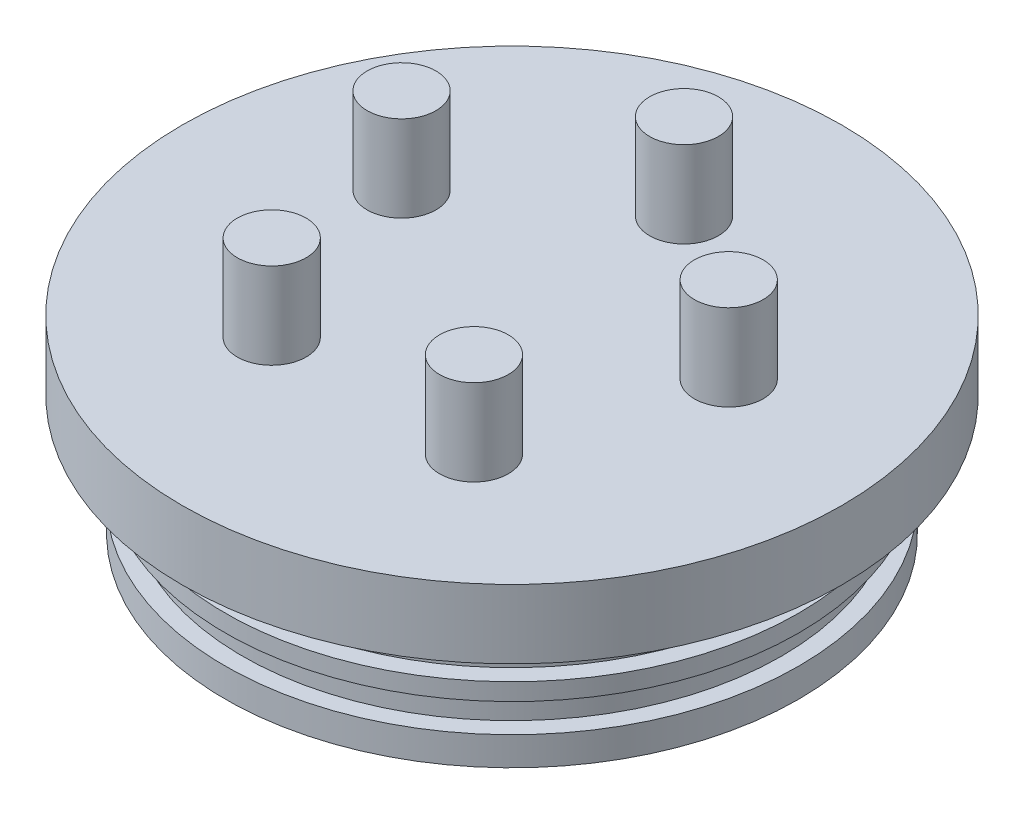
ISO-10303-21;
HEADER;
FILE_DESCRIPTION(('STEP AP214'),'2;1');
FILE_NAME('part.step','',(''),(''),'','','');
FILE_SCHEMA(('AUTOMOTIVE_DESIGN { 1 0 10303 214 1 1 1 1 }'));
ENDSEC;
DATA;
#1=APPLICATION_CONTEXT('core data for automotive mechanical design processes');
#2=APPLICATION_PROTOCOL_DEFINITION('international standard','automotive_design',2000,#1);
#3=PRODUCT_CONTEXT('',#1,'mechanical');
#4=PRODUCT('Part','Part','',(#3));
#5=PRODUCT_RELATED_PRODUCT_CATEGORY('part','',(#4));
#6=PRODUCT_DEFINITION_FORMATION('','',#4);
#7=PRODUCT_DEFINITION_CONTEXT('part definition',#1,'design');
#8=PRODUCT_DEFINITION('design','',#6,#7);
#9=PRODUCT_DEFINITION_SHAPE('','',#8);
#10=(LENGTH_UNIT() NAMED_UNIT(*) SI_UNIT(.MILLI.,.METRE.));
#11=(NAMED_UNIT(*) PLANE_ANGLE_UNIT() SI_UNIT($,.RADIAN.));
#12=(NAMED_UNIT(*) SI_UNIT($,.STERADIAN.) SOLID_ANGLE_UNIT());
#13=UNCERTAINTY_MEASURE_WITH_UNIT(LENGTH_MEASURE(1.E-05),#10,'distance_accuracy_value','');
#14=(GEOMETRIC_REPRESENTATION_CONTEXT(3) GLOBAL_UNCERTAINTY_ASSIGNED_CONTEXT((#13)) GLOBAL_UNIT_ASSIGNED_CONTEXT((#10,
#11,#12)) REPRESENTATION_CONTEXT('',''));
#15=CARTESIAN_POINT('',(0.,0.,0.));
#16=DIRECTION('',(0.,0.,1.));
#17=DIRECTION('',(1.,0.,0.));
#18=AXIS2_PLACEMENT_3D('',#15,#16,#17);
#19=CARTESIAN_POINT('',(0.,0.,0.));
#20=DIRECTION('',(0.,-1.,0.));
#21=DIRECTION('',(1.,0.,0.));
#22=AXIS2_PLACEMENT_3D('',#19,#20,#21);
#23=PLANE('',#22);
#24=CARTESIAN_POINT('',(0.,0.,0.));
#25=DIRECTION('',(0.,-1.,0.));
#26=DIRECTION('',(1.,0.,0.));
#27=AXIS2_PLACEMENT_3D('',#24,#25,#26);
#28=CIRCLE('',#27,45.);
#29=CARTESIAN_POINT('',(45.,0.,0.));
#30=VERTEX_POINT('',#29);
#31=EDGE_CURVE('E10',#30,#30,#28,.T.);
#32=ORIENTED_EDGE('',*,*,#31,.T.);
#33=EDGE_LOOP('',(#32));
#34=FACE_BOUND('',#33,.T.);
#35=ADVANCED_FACE('F32',(#34),#23,.T.);
#36=CARTESIAN_POINT('',(0.,0.,0.));
#37=DIRECTION('',(0.,-1.,0.));
#38=DIRECTION('',(1.,0.,0.));
#39=AXIS2_PLACEMENT_3D('',#36,#37,#38);
#40=CYLINDRICAL_SURFACE('',#39,45.);
#41=CARTESIAN_POINT('',(0.,-27.,0.));
#42=DIRECTION('',(0.,-1.,0.));
#43=DIRECTION('',(1.,0.,0.));
#44=AXIS2_PLACEMENT_3D('',#41,#42,#43);
#45=CIRCLE('',#44,45.);
#46=CARTESIAN_POINT('',(45.,-27.,0.));
#47=VERTEX_POINT('',#46);
#48=EDGE_CURVE('E38',#47,#47,#45,.T.);
#49=ORIENTED_EDGE('',*,*,#48,.T.);
#50=EDGE_LOOP('',(#49));
#51=FACE_BOUND('',#50,.T.);
#52=ORIENTED_EDGE('',*,*,#31,.F.);
#53=EDGE_LOOP('',(#52));
#54=FACE_BOUND('',#53,.T.);
#55=ADVANCED_FACE('F205',(#51,#54),#40,.F.);
#56=CARTESIAN_POINT('',(45.,-27.,0.));
#57=DIRECTION('',(0.,-1.,0.));
#58=DIRECTION('',(1.,0.,0.));
#59=AXIS2_PLACEMENT_3D('',#56,#57,#58);
#60=PLANE('',#59);
#61=CARTESIAN_POINT('',(0.,-27.,0.));
#62=DIRECTION('',(0.,-1.,0.));
#63=DIRECTION('',(1.,0.,0.));
#64=AXIS2_PLACEMENT_3D('',#61,#62,#63);
#65=CIRCLE('',#64,50.);
#66=CARTESIAN_POINT('',(50.,-27.,0.));
#67=VERTEX_POINT('',#66);
#68=EDGE_CURVE('E42',#67,#67,#65,.T.);
#69=ORIENTED_EDGE('',*,*,#68,.T.);
#70=EDGE_LOOP('',(#69));
#71=FACE_BOUND('',#70,.T.);
#72=ORIENTED_EDGE('',*,*,#48,.F.);
#73=EDGE_LOOP('',(#72));
#74=FACE_BOUND('',#73,.T.);
#75=ADVANCED_FACE('F199',(#71,#74),#60,.T.);
#76=CARTESIAN_POINT('',(0.,0.,0.));
#77=DIRECTION('',(0.,-1.,0.));
#78=DIRECTION('',(1.,0.,0.));
#79=AXIS2_PLACEMENT_3D('',#76,#77,#78);
#80=CYLINDRICAL_SURFACE('',#79,50.);
#81=CARTESIAN_POINT('',(0.,-22.,0.));
#82=DIRECTION('',(0.,-1.,0.));
#83=DIRECTION('',(1.,0.,0.));
#84=AXIS2_PLACEMENT_3D('',#81,#82,#83);
#85=CIRCLE('',#84,50.);
#86=CARTESIAN_POINT('',(50.,-22.,0.));
#87=VERTEX_POINT('',#86);
#88=EDGE_CURVE('E46',#87,#87,#85,.T.);
#89=ORIENTED_EDGE('',*,*,#88,.T.);
#90=EDGE_LOOP('',(#89));
#91=FACE_BOUND('',#90,.T.);
#92=ORIENTED_EDGE('',*,*,#68,.F.);
#93=EDGE_LOOP('',(#92));
#94=FACE_BOUND('',#93,.T.);
#95=ADVANCED_FACE('F193',(#91,#94),#80,.T.);
#96=CARTESIAN_POINT('',(50.,-22.,0.));
#97=DIRECTION('',(0.,1.,0.));
#98=DIRECTION('',(-1.,0.,0.));
#99=AXIS2_PLACEMENT_3D('',#96,#97,#98);
#100=PLANE('',#99);
#101=CARTESIAN_POINT('',(0.,-22.,0.));
#102=DIRECTION('',(0.,-1.,0.));
#103=DIRECTION('',(1.,0.,0.));
#104=AXIS2_PLACEMENT_3D('',#101,#102,#103);
#105=CIRCLE('',#104,47.);
#106=CARTESIAN_POINT('',(47.,-22.,0.));
#107=VERTEX_POINT('',#106);
#108=EDGE_CURVE('E51',#107,#107,#105,.T.);
#109=ORIENTED_EDGE('',*,*,#108,.T.);
#110=EDGE_LOOP('',(#109));
#111=FACE_BOUND('',#110,.T.);
#112=ORIENTED_EDGE('',*,*,#88,.F.);
#113=EDGE_LOOP('',(#112));
#114=FACE_BOUND('',#113,.T.);
#115=ADVANCED_FACE('F187',(#111,#114),#100,.T.);
#116=CARTESIAN_POINT('',(0.,0.,0.));
#117=DIRECTION('',(0.,-1.,0.));
#118=DIRECTION('',(1.,0.,0.));
#119=AXIS2_PLACEMENT_3D('',#116,#117,#118);
#120=CYLINDRICAL_SURFACE('',#119,47.);
#121=CARTESIAN_POINT('',(0.,-17.,0.));
#122=DIRECTION('',(0.,-1.,0.));
#123=DIRECTION('',(1.,0.,0.));
#124=AXIS2_PLACEMENT_3D('',#121,#122,#123);
#125=CIRCLE('',#124,47.);
#126=CARTESIAN_POINT('',(47.,-17.,0.));
#127=VERTEX_POINT('',#126);
#128=EDGE_CURVE('E54',#127,#127,#125,.T.);
#129=ORIENTED_EDGE('',*,*,#128,.T.);
#130=EDGE_LOOP('',(#129));
#131=FACE_BOUND('',#130,.T.);
#132=ORIENTED_EDGE('',*,*,#108,.F.);
#133=EDGE_LOOP('',(#132));
#134=FACE_BOUND('',#133,.T.);
#135=ADVANCED_FACE('F181',(#131,#134),#120,.T.);
#136=CARTESIAN_POINT('',(47.,-17.,0.));
#137=DIRECTION('',(0.,-1.,0.));
#138=DIRECTION('',(1.,0.,0.));
#139=AXIS2_PLACEMENT_3D('',#136,#137,#138);
#140=PLANE('',#139);
#141=CARTESIAN_POINT('',(0.,-17.,0.));
#142=DIRECTION('',(0.,-1.,0.));
#143=DIRECTION('',(1.,0.,0.));
#144=AXIS2_PLACEMENT_3D('',#141,#142,#143);
#145=CIRCLE('',#144,50.);
#146=CARTESIAN_POINT('',(50.,-17.,0.));
#147=VERTEX_POINT('',#146);
#148=EDGE_CURVE('E57',#147,#147,#145,.T.);
#149=ORIENTED_EDGE('',*,*,#148,.T.);
#150=EDGE_LOOP('',(#149));
#151=FACE_BOUND('',#150,.T.);
#152=ORIENTED_EDGE('',*,*,#128,.F.);
#153=EDGE_LOOP('',(#152));
#154=FACE_BOUND('',#153,.T.);
#155=ADVANCED_FACE('F175',(#151,#154),#140,.T.);
#156=CARTESIAN_POINT('',(0.,0.,0.));
#157=DIRECTION('',(0.,-1.,0.));
#158=DIRECTION('',(1.,0.,0.));
#159=AXIS2_PLACEMENT_3D('',#156,#157,#158);
#160=CYLINDRICAL_SURFACE('',#159,50.);
#161=CARTESIAN_POINT('',(0.,-14.,0.));
#162=DIRECTION('',(0.,-1.,0.));
#163=DIRECTION('',(1.,0.,0.));
#164=AXIS2_PLACEMENT_3D('',#161,#162,#163);
#165=CIRCLE('',#164,50.);
#166=CARTESIAN_POINT('',(50.,-14.,0.));
#167=VERTEX_POINT('',#166);
#168=EDGE_CURVE('E60',#167,#167,#165,.T.);
#169=ORIENTED_EDGE('',*,*,#168,.T.);
#170=EDGE_LOOP('',(#169));
#171=FACE_BOUND('',#170,.T.);
#172=ORIENTED_EDGE('',*,*,#148,.F.);
#173=EDGE_LOOP('',(#172));
#174=FACE_BOUND('',#173,.T.);
#175=ADVANCED_FACE('F169',(#171,#174),#160,.T.);
#176=CARTESIAN_POINT('',(50.,-14.,0.));
#177=DIRECTION('',(0.,1.,0.));
#178=DIRECTION('',(-1.,0.,0.));
#179=AXIS2_PLACEMENT_3D('',#176,#177,#178);
#180=PLANE('',#179);
#181=CARTESIAN_POINT('',(0.,-14.,0.));
#182=DIRECTION('',(0.,-1.,0.));
#183=DIRECTION('',(1.,0.,0.));
#184=AXIS2_PLACEMENT_3D('',#181,#182,#183);
#185=CIRCLE('',#184,47.);
#186=CARTESIAN_POINT('',(47.,-14.,0.));
#187=VERTEX_POINT('',#186);
#188=EDGE_CURVE('E63',#187,#187,#185,.T.);
#189=ORIENTED_EDGE('',*,*,#188,.T.);
#190=EDGE_LOOP('',(#189));
#191=FACE_BOUND('',#190,.T.);
#192=ORIENTED_EDGE('',*,*,#168,.F.);
#193=EDGE_LOOP('',(#192));
#194=FACE_BOUND('',#193,.T.);
#195=ADVANCED_FACE('F163',(#191,#194),#180,.T.);
#196=CARTESIAN_POINT('',(0.,0.,0.));
#197=DIRECTION('',(0.,-1.,0.));
#198=DIRECTION('',(1.,0.,0.));
#199=AXIS2_PLACEMENT_3D('',#196,#197,#198);
#200=CYLINDRICAL_SURFACE('',#199,47.);
#201=CARTESIAN_POINT('',(0.,-9.,0.));
#202=DIRECTION('',(0.,-1.,0.));
#203=DIRECTION('',(1.,0.,0.));
#204=AXIS2_PLACEMENT_3D('',#201,#202,#203);
#205=CIRCLE('',#204,47.);
#206=CARTESIAN_POINT('',(47.,-8.99999999999999,0.));
#207=VERTEX_POINT('',#206);
#208=EDGE_CURVE('E66',#207,#207,#205,.T.);
#209=ORIENTED_EDGE('',*,*,#208,.T.);
#210=EDGE_LOOP('',(#209));
#211=FACE_BOUND('',#210,.T.);
#212=ORIENTED_EDGE('',*,*,#188,.F.);
#213=EDGE_LOOP('',(#212));
#214=FACE_BOUND('',#213,.T.);
#215=ADVANCED_FACE('F157',(#211,#214),#200,.T.);
#216=CARTESIAN_POINT('',(47.,-8.99999999999999,0.));
#217=DIRECTION('',(0.,-1.,0.));
#218=DIRECTION('',(1.,0.,0.));
#219=AXIS2_PLACEMENT_3D('',#216,#217,#218);
#220=PLANE('',#219);
#221=CARTESIAN_POINT('',(0.,-9.,0.));
#222=DIRECTION('',(0.,-1.,0.));
#223=DIRECTION('',(1.,0.,0.));
#224=AXIS2_PLACEMENT_3D('',#221,#222,#223);
#225=CIRCLE('',#224,50.);
#226=CARTESIAN_POINT('',(50.,-8.99999999999999,0.));
#227=VERTEX_POINT('',#226);
#228=EDGE_CURVE('E69',#227,#227,#225,.T.);
#229=ORIENTED_EDGE('',*,*,#228,.T.);
#230=EDGE_LOOP('',(#229));
#231=FACE_BOUND('',#230,.T.);
#232=ORIENTED_EDGE('',*,*,#208,.F.);
#233=EDGE_LOOP('',(#232));
#234=FACE_BOUND('',#233,.T.);
#235=ADVANCED_FACE('F151',(#231,#234),#220,.T.);
#236=CARTESIAN_POINT('',(0.,0.,0.));
#237=DIRECTION('',(0.,-1.,0.));
#238=DIRECTION('',(1.,0.,0.));
#239=AXIS2_PLACEMENT_3D('',#236,#237,#238);
#240=CYLINDRICAL_SURFACE('',#239,50.);
#241=CARTESIAN_POINT('',(0.,-6.,0.));
#242=DIRECTION('',(0.,-1.,0.));
#243=DIRECTION('',(1.,0.,0.));
#244=AXIS2_PLACEMENT_3D('',#241,#242,#243);
#245=CIRCLE('',#244,50.);
#246=CARTESIAN_POINT('',(50.,-5.99999999999999,0.));
#247=VERTEX_POINT('',#246);
#248=EDGE_CURVE('E72',#247,#247,#245,.T.);
#249=ORIENTED_EDGE('',*,*,#248,.T.);
#250=EDGE_LOOP('',(#249));
#251=FACE_BOUND('',#250,.T.);
#252=ORIENTED_EDGE('',*,*,#228,.F.);
#253=EDGE_LOOP('',(#252));
#254=FACE_BOUND('',#253,.T.);
#255=ADVANCED_FACE('F145',(#251,#254),#240,.T.);
#256=CARTESIAN_POINT('',(50.,-5.99999999999999,0.));
#257=DIRECTION('',(0.,-1.,0.));
#258=DIRECTION('',(1.,0.,0.));
#259=AXIS2_PLACEMENT_3D('',#256,#257,#258);
#260=PLANE('',#259);
#261=CARTESIAN_POINT('',(0.,-6.,0.));
#262=DIRECTION('',(0.,-1.,0.));
#263=DIRECTION('',(1.,0.,0.));
#264=AXIS2_PLACEMENT_3D('',#261,#262,#263);
#265=CIRCLE('',#264,57.5);
#266=CARTESIAN_POINT('',(57.5,-5.99999999999999,0.));
#267=VERTEX_POINT('',#266);
#268=EDGE_CURVE('E75',#267,#267,#265,.T.);
#269=ORIENTED_EDGE('',*,*,#268,.T.);
#270=EDGE_LOOP('',(#269));
#271=FACE_BOUND('',#270,.T.);
#272=ORIENTED_EDGE('',*,*,#248,.F.);
#273=EDGE_LOOP('',(#272));
#274=FACE_BOUND('',#273,.T.);
#275=ADVANCED_FACE('F139',(#271,#274),#260,.T.);
#276=CARTESIAN_POINT('',(0.,0.,0.));
#277=DIRECTION('',(0.,-1.,0.));
#278=DIRECTION('',(1.,0.,0.));
#279=AXIS2_PLACEMENT_3D('',#276,#277,#278);
#280=CYLINDRICAL_SURFACE('',#279,57.5);
#281=CARTESIAN_POINT('',(0.,6.,0.));
#282=DIRECTION('',(0.,-1.,0.));
#283=DIRECTION('',(1.,0.,0.));
#284=AXIS2_PLACEMENT_3D('',#281,#282,#283);
#285=CIRCLE('',#284,57.5);
#286=CARTESIAN_POINT('',(57.5,6.00000000000001,0.));
#287=VERTEX_POINT('',#286);
#288=EDGE_CURVE('E78',#287,#287,#285,.T.);
#289=ORIENTED_EDGE('',*,*,#288,.T.);
#290=EDGE_LOOP('',(#289));
#291=FACE_BOUND('',#290,.T.);
#292=ORIENTED_EDGE('',*,*,#268,.F.);
#293=EDGE_LOOP('',(#292));
#294=FACE_BOUND('',#293,.T.);
#295=ADVANCED_FACE('F125',(#291,#294),#280,.T.);
#296=CARTESIAN_POINT('',(57.5,6.00000000000001,0.));
#297=DIRECTION('',(0.,1.,0.));
#298=DIRECTION('',(-1.,0.,0.));
#299=AXIS2_PLACEMENT_3D('',#296,#297,#298);
#300=PLANE('',#299);
#301=CARTESIAN_POINT('',(-28.5316954888546,6.,-9.27050983124842));
#302=DIRECTION('',(0.,1.,0.));
#303=DIRECTION('',(-1.,0.,0.));
#304=AXIS2_PLACEMENT_3D('',#301,#302,#303);
#305=CIRCLE('',#304,6.);
#306=CARTESIAN_POINT('',(-34.5316954888546,6.,-9.27050983124842));
#307=VERTEX_POINT('',#306);
#308=EDGE_CURVE('E106',#307,#307,#305,.T.);
#309=ORIENTED_EDGE('',*,*,#308,.F.);
#310=EDGE_LOOP('',(#309));
#311=FACE_BOUND('',#310,.T.);
#312=CARTESIAN_POINT('',(-17.6335575687742,6.,24.2705098312484));
#313=DIRECTION('',(0.,1.,0.));
#314=DIRECTION('',(-1.,0.,0.));
#315=AXIS2_PLACEMENT_3D('',#312,#313,#314);
#316=CIRCLE('',#315,6.);
#317=CARTESIAN_POINT('',(-23.6335575687742,6.,24.2705098312484));
#318=VERTEX_POINT('',#317);
#319=EDGE_CURVE('E100',#318,#318,#316,.T.);
#320=ORIENTED_EDGE('',*,*,#319,.F.);
#321=EDGE_LOOP('',(#320));
#322=FACE_BOUND('',#321,.T.);
#323=CARTESIAN_POINT('',(17.6335575687742,6.,24.2705098312484));
#324=DIRECTION('',(0.,1.,0.));
#325=DIRECTION('',(-1.,0.,0.));
#326=AXIS2_PLACEMENT_3D('',#323,#324,#325);
#327=CIRCLE('',#326,6.);
#328=CARTESIAN_POINT('',(11.6335575687742,6.,24.2705098312484));
#329=VERTEX_POINT('',#328);
#330=EDGE_CURVE('E94',#329,#329,#327,.T.);
#331=ORIENTED_EDGE('',*,*,#330,.F.);
#332=EDGE_LOOP('',(#331));
#333=FACE_BOUND('',#332,.T.);
#334=CARTESIAN_POINT('',(28.5316954888546,6.00000000000001,-9.27050983124843));
#335=DIRECTION('',(0.,1.,0.));
#336=DIRECTION('',(-1.,0.,0.));
#337=AXIS2_PLACEMENT_3D('',#334,#335,#336);
#338=CIRCLE('',#337,6.);
#339=CARTESIAN_POINT('',(22.5316954888546,6.00000000000001,-9.27050983124843));
#340=VERTEX_POINT('',#339);
#341=EDGE_CURVE('E88',#340,#340,#338,.T.);
#342=ORIENTED_EDGE('',*,*,#341,.F.);
#343=EDGE_LOOP('',(#342));
#344=FACE_BOUND('',#343,.T.);
#345=CARTESIAN_POINT('',(0.,6.,-30.));
#346=DIRECTION('',(0.,1.,0.));
#347=DIRECTION('',(-1.,0.,0.));
#348=AXIS2_PLACEMENT_3D('',#345,#346,#347);
#349=CIRCLE('',#348,6.);
#350=CARTESIAN_POINT('',(-6.,6.,-30.));
#351=VERTEX_POINT('',#350);
#352=EDGE_CURVE('E82',#351,#351,#349,.T.);
#353=ORIENTED_EDGE('',*,*,#352,.F.);
#354=EDGE_LOOP('',(#353));
#355=FACE_BOUND('',#354,.T.);
#356=ORIENTED_EDGE('',*,*,#288,.F.);
#357=EDGE_LOOP('',(#356));
#358=FACE_BOUND('',#357,.T.);
#359=ADVANCED_FACE('F121',(#311,#322,#333,#344,#355,#358),#300,.T.);
#360=CARTESIAN_POINT('',(0.,21.,-30.));
#361=DIRECTION('',(0.,-1.,0.));
#362=DIRECTION('',(1.,0.,0.));
#363=AXIS2_PLACEMENT_3D('',#360,#361,#362);
#364=CYLINDRICAL_SURFACE('',#363,6.);
#365=CARTESIAN_POINT('',(0.,21.,-30.));
#366=DIRECTION('',(0.,1.,0.));
#367=DIRECTION('',(-1.,0.,0.));
#368=AXIS2_PLACEMENT_3D('',#365,#366,#367);
#369=CIRCLE('',#368,6.);
#370=CARTESIAN_POINT('',(-6.,21.,-30.));
#371=VERTEX_POINT('',#370);
#372=EDGE_CURVE('E81',#371,#371,#369,.T.);
#373=ORIENTED_EDGE('',*,*,#372,.F.);
#374=EDGE_LOOP('',(#373));
#375=FACE_BOUND('',#374,.T.);
#376=ORIENTED_EDGE('',*,*,#352,.T.);
#377=EDGE_LOOP('',(#376));
#378=FACE_BOUND('',#377,.T.);
#379=ADVANCED_FACE('F124',(#375,#378),#364,.T.);
#380=CARTESIAN_POINT('',(0.,21.,-30.));
#381=DIRECTION('',(0.,1.,0.));
#382=DIRECTION('',(-1.,0.,0.));
#383=AXIS2_PLACEMENT_3D('',#380,#381,#382);
#384=PLANE('',#383);
#385=ORIENTED_EDGE('',*,*,#372,.T.);
#386=EDGE_LOOP('',(#385));
#387=FACE_BOUND('',#386,.T.);
#388=ADVANCED_FACE('F303',(#387),#384,.T.);
#389=CARTESIAN_POINT('',(28.5316954888546,21.,-9.27050983124843));
#390=DIRECTION('',(0.,-1.,0.));
#391=DIRECTION('',(1.,0.,0.));
#392=AXIS2_PLACEMENT_3D('',#389,#390,#391);
#393=CYLINDRICAL_SURFACE('',#392,6.);
#394=CARTESIAN_POINT('',(28.5316954888546,21.,-9.27050983124843));
#395=DIRECTION('',(0.,1.,0.));
#396=DIRECTION('',(-1.,0.,0.));
#397=AXIS2_PLACEMENT_3D('',#394,#395,#396);
#398=CIRCLE('',#397,6.);
#399=CARTESIAN_POINT('',(22.5316954888546,21.,-9.27050983124843));
#400=VERTEX_POINT('',#399);
#401=EDGE_CURVE('E85',#400,#400,#398,.T.);
#402=ORIENTED_EDGE('',*,*,#401,.F.);
#403=EDGE_LOOP('',(#402));
#404=FACE_BOUND('',#403,.T.);
#405=ORIENTED_EDGE('',*,*,#341,.T.);
#406=EDGE_LOOP('',(#405));
#407=FACE_BOUND('',#406,.T.);
#408=ADVANCED_FACE('F316',(#404,#407),#393,.T.);
#409=CARTESIAN_POINT('',(28.5316954888546,21.,-9.27050983124843));
#410=DIRECTION('',(0.,1.,0.));
#411=DIRECTION('',(-1.,0.,0.));
#412=AXIS2_PLACEMENT_3D('',#409,#410,#411);
#413=PLANE('',#412);
#414=ORIENTED_EDGE('',*,*,#401,.T.);
#415=EDGE_LOOP('',(#414));
#416=FACE_BOUND('',#415,.T.);
#417=ADVANCED_FACE('F328',(#416),#413,.T.);
#418=CARTESIAN_POINT('',(17.6335575687742,21.,24.2705098312484));
#419=DIRECTION('',(0.,-1.,0.));
#420=DIRECTION('',(1.,0.,0.));
#421=AXIS2_PLACEMENT_3D('',#418,#419,#420);
#422=CYLINDRICAL_SURFACE('',#421,6.);
#423=CARTESIAN_POINT('',(17.6335575687742,21.,24.2705098312484));
#424=DIRECTION('',(0.,1.,0.));
#425=DIRECTION('',(-1.,0.,0.));
#426=AXIS2_PLACEMENT_3D('',#423,#424,#425);
#427=CIRCLE('',#426,6.);
#428=CARTESIAN_POINT('',(11.6335575687742,21.,24.2705098312484));
#429=VERTEX_POINT('',#428);
#430=EDGE_CURVE('E91',#429,#429,#427,.T.);
#431=ORIENTED_EDGE('',*,*,#430,.F.);
#432=EDGE_LOOP('',(#431));
#433=FACE_BOUND('',#432,.T.);
#434=ORIENTED_EDGE('',*,*,#330,.T.);
#435=EDGE_LOOP('',(#434));
#436=FACE_BOUND('',#435,.T.);
#437=ADVANCED_FACE('F338',(#433,#436),#422,.T.);
#438=CARTESIAN_POINT('',(17.6335575687742,21.,24.2705098312484));
#439=DIRECTION('',(0.,1.,0.));
#440=DIRECTION('',(-1.,0.,0.));
#441=AXIS2_PLACEMENT_3D('',#438,#439,#440);
#442=PLANE('',#441);
#443=ORIENTED_EDGE('',*,*,#430,.T.);
#444=EDGE_LOOP('',(#443));
#445=FACE_BOUND('',#444,.T.);
#446=ADVANCED_FACE('F349',(#445),#442,.T.);
#447=CARTESIAN_POINT('',(-17.6335575687742,21.,24.2705098312484));
#448=DIRECTION('',(0.,-1.,0.));
#449=DIRECTION('',(1.,0.,0.));
#450=AXIS2_PLACEMENT_3D('',#447,#448,#449);
#451=CYLINDRICAL_SURFACE('',#450,6.);
#452=CARTESIAN_POINT('',(-17.6335575687742,21.,24.2705098312484));
#453=DIRECTION('',(0.,1.,0.));
#454=DIRECTION('',(-1.,0.,0.));
#455=AXIS2_PLACEMENT_3D('',#452,#453,#454);
#456=CIRCLE('',#455,6.);
#457=CARTESIAN_POINT('',(-23.6335575687742,21.,24.2705098312484));
#458=VERTEX_POINT('',#457);
#459=EDGE_CURVE('E97',#458,#458,#456,.T.);
#460=ORIENTED_EDGE('',*,*,#459,.F.);
#461=EDGE_LOOP('',(#460));
#462=FACE_BOUND('',#461,.T.);
#463=ORIENTED_EDGE('',*,*,#319,.T.);
#464=EDGE_LOOP('',(#463));
#465=FACE_BOUND('',#464,.T.);
#466=ADVANCED_FACE('F361',(#462,#465),#451,.T.);
#467=CARTESIAN_POINT('',(-17.6335575687742,21.,24.2705098312484));
#468=DIRECTION('',(0.,1.,0.));
#469=DIRECTION('',(-1.,0.,0.));
#470=AXIS2_PLACEMENT_3D('',#467,#468,#469);
#471=PLANE('',#470);
#472=ORIENTED_EDGE('',*,*,#459,.T.);
#473=EDGE_LOOP('',(#472));
#474=FACE_BOUND('',#473,.T.);
#475=ADVANCED_FACE('F117',(#474),#471,.T.);
#476=CARTESIAN_POINT('',(-28.5316954888546,21.,-9.27050983124842));
#477=DIRECTION('',(0.,-1.,0.));
#478=DIRECTION('',(1.,0.,0.));
#479=AXIS2_PLACEMENT_3D('',#476,#477,#478);
#480=CYLINDRICAL_SURFACE('',#479,6.);
#481=CARTESIAN_POINT('',(-28.5316954888546,21.,-9.27050983124842));
#482=DIRECTION('',(0.,1.,0.));
#483=DIRECTION('',(-1.,0.,0.));
#484=AXIS2_PLACEMENT_3D('',#481,#482,#483);
#485=CIRCLE('',#484,6.);
#486=CARTESIAN_POINT('',(-34.5316954888546,21.,-9.27050983124842));
#487=VERTEX_POINT('',#486);
#488=EDGE_CURVE('E103',#487,#487,#485,.T.);
#489=ORIENTED_EDGE('',*,*,#488,.F.);
#490=EDGE_LOOP('',(#489));
#491=FACE_BOUND('',#490,.T.);
#492=ORIENTED_EDGE('',*,*,#308,.T.);
#493=EDGE_LOOP('',(#492));
#494=FACE_BOUND('',#493,.T.);
#495=ADVANCED_FACE('F114',(#491,#494),#480,.T.);
#496=CARTESIAN_POINT('',(-28.5316954888546,21.,-9.27050983124842));
#497=DIRECTION('',(0.,1.,0.));
#498=DIRECTION('',(-1.,0.,0.));
#499=AXIS2_PLACEMENT_3D('',#496,#497,#498);
#500=PLANE('',#499);
#501=ORIENTED_EDGE('',*,*,#488,.T.);
#502=EDGE_LOOP('',(#501));
#503=FACE_BOUND('',#502,.T.);
#504=ADVANCED_FACE('F112',(#503),#500,.T.);
#505=CLOSED_SHELL('',(#35,#55,#75,#95,#115,#135,#155,#175,#195,#215,#235,#255,#275,#295,#359,
#379,#388,#408,#417,#437,#446,#466,#475,#495,#504));
#506=MANIFOLD_SOLID_BREP('B2',#505);
#507=ADVANCED_BREP_SHAPE_REPRESENTATION('',(#18,#506),#14);
#508=SHAPE_DEFINITION_REPRESENTATION(#9,#507);
ENDSEC;
END-ISO-10303-21;
